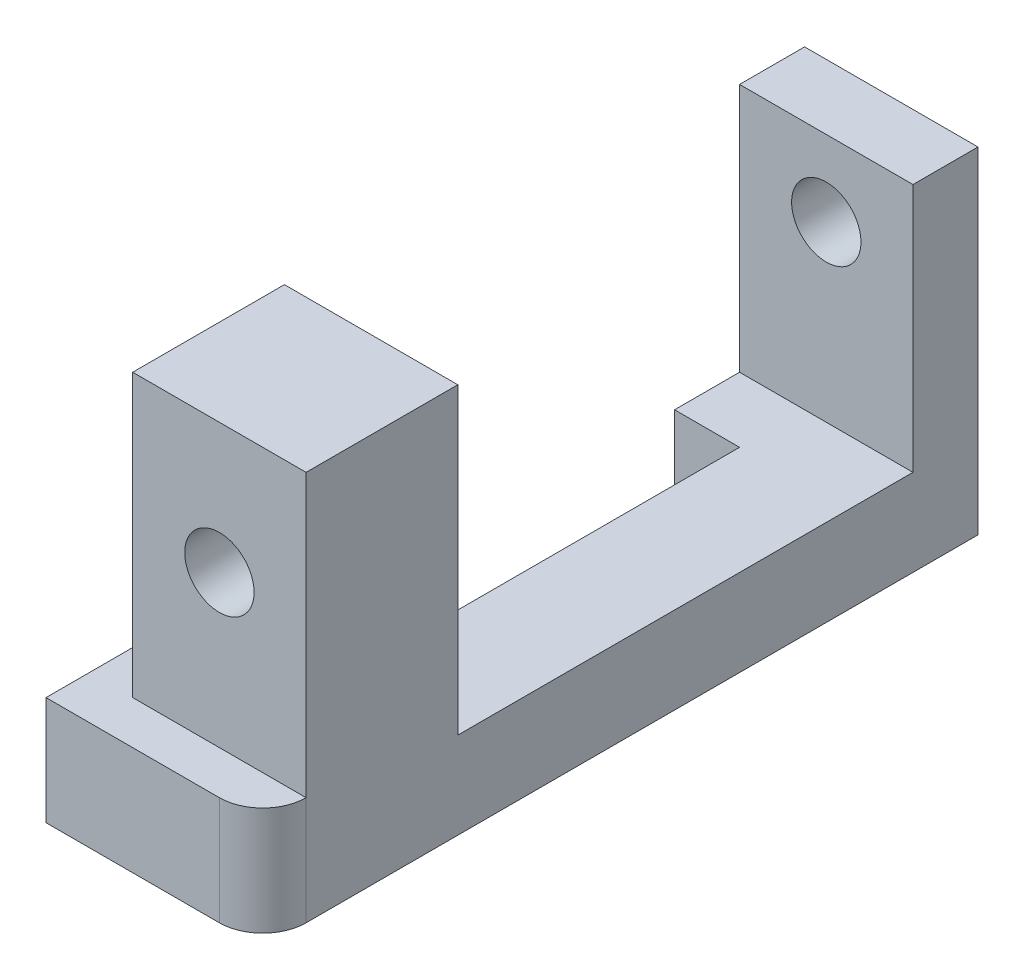
ISO-10303-21;
HEADER;
FILE_DESCRIPTION(('STEP AP214'),'2;1');
FILE_NAME('part.step','',(''),(''),'','','');
FILE_SCHEMA(('AUTOMOTIVE_DESIGN { 1 0 10303 214 1 1 1 1 }'));
ENDSEC;
DATA;
#1=APPLICATION_CONTEXT('core data for automotive mechanical design processes');
#2=APPLICATION_PROTOCOL_DEFINITION('international standard','automotive_design',2000,#1);
#3=PRODUCT_CONTEXT('',#1,'mechanical');
#4=PRODUCT('Part','Part','',(#3));
#5=PRODUCT_RELATED_PRODUCT_CATEGORY('part','',(#4));
#6=PRODUCT_DEFINITION_FORMATION('','',#4);
#7=PRODUCT_DEFINITION_CONTEXT('part definition',#1,'design');
#8=PRODUCT_DEFINITION('design','',#6,#7);
#9=PRODUCT_DEFINITION_SHAPE('','',#8);
#10=(LENGTH_UNIT() NAMED_UNIT(*) SI_UNIT(.MILLI.,.METRE.));
#11=(NAMED_UNIT(*) PLANE_ANGLE_UNIT() SI_UNIT($,.RADIAN.));
#12=(NAMED_UNIT(*) SI_UNIT($,.STERADIAN.) SOLID_ANGLE_UNIT());
#13=UNCERTAINTY_MEASURE_WITH_UNIT(LENGTH_MEASURE(1.E-05),#10,'distance_accuracy_value','');
#14=(GEOMETRIC_REPRESENTATION_CONTEXT(3) GLOBAL_UNCERTAINTY_ASSIGNED_CONTEXT((#13)) GLOBAL_UNIT_ASSIGNED_CONTEXT((#10,
#11,#12)) REPRESENTATION_CONTEXT('',''));
#15=CARTESIAN_POINT('',(0.,0.,0.));
#16=DIRECTION('',(0.,0.,1.));
#17=DIRECTION('',(1.,0.,0.));
#18=AXIS2_PLACEMENT_3D('',#15,#16,#17);
#19=CARTESIAN_POINT('',(-8.,16.,3.));
#20=DIRECTION('',(0.,0.,1.));
#21=DIRECTION('',(0.,-1.,0.));
#22=AXIS2_PLACEMENT_3D('',#19,#20,#21);
#23=PLANE('',#22);
#24=CARTESIAN_POINT('',(-4.,12.,3.));
#25=DIRECTION('',(0.,0.,1.));
#26=DIRECTION('',(0.,-1.,0.));
#27=AXIS2_PLACEMENT_3D('',#24,#25,#26);
#28=CIRCLE('',#27,1.6);
#29=CARTESIAN_POINT('',(-4.,10.4,3.));
#30=VERTEX_POINT('',#29);
#31=EDGE_CURVE('E251',#30,#30,#28,.T.);
#32=ORIENTED_EDGE('',*,*,#31,.F.);
#33=EDGE_LOOP('',(#32));
#34=FACE_BOUND('',#33,.T.);
#35=DIRECTION('',(0.,-1.,0.));
#36=VECTOR('',#35,1.);
#37=CARTESIAN_POINT('',(0.,16.,3.));
#38=LINE('',#37,#36);
#39=CARTESIAN_POINT('',(0.,15.5,3.));
#40=VERTEX_POINT('',#39);
#41=CARTESIAN_POINT('',(0.,4.,3.));
#42=VERTEX_POINT('',#41);
#43=EDGE_CURVE('E163',#40,#42,#38,.T.);
#44=ORIENTED_EDGE('',*,*,#43,.F.);
#45=DIRECTION('',(1.,0.,0.));
#46=VECTOR('',#45,1.);
#47=CARTESIAN_POINT('',(0.,15.5,3.));
#48=LINE('',#47,#46);
#49=CARTESIAN_POINT('',(-8.,15.5,3.));
#50=VERTEX_POINT('',#49);
#51=EDGE_CURVE('E50',#50,#40,#48,.T.);
#52=ORIENTED_EDGE('',*,*,#51,.F.);
#53=DIRECTION('',(0.,-1.,0.));
#54=VECTOR('',#53,1.);
#55=CARTESIAN_POINT('',(-8.,16.,3.));
#56=LINE('',#55,#54);
#57=CARTESIAN_POINT('',(-8.,4.,3.));
#58=VERTEX_POINT('',#57);
#59=EDGE_CURVE('E204',#50,#58,#56,.T.);
#60=ORIENTED_EDGE('',*,*,#59,.T.);
#61=DIRECTION('',(1.,0.,0.));
#62=VECTOR('',#61,1.);
#63=CARTESIAN_POINT('',(-8.,4.,3.));
#64=LINE('',#63,#62);
#65=EDGE_CURVE('E185',#58,#42,#64,.T.);
#66=ORIENTED_EDGE('',*,*,#65,.T.);
#67=EDGE_LOOP('',(#44,#52,#60,#66));
#68=FACE_BOUND('',#67,.T.);
#69=ADVANCED_FACE('F33',(#34,#68),#23,.T.);
#70=CARTESIAN_POINT('',(-8.,0.,0.));
#71=DIRECTION('',(1.,0.,0.));
#72=DIRECTION('',(0.,0.,-1.));
#73=AXIS2_PLACEMENT_3D('',#70,#71,#72);
#74=PLANE('',#73);
#75=DIRECTION('',(0.,0.,1.));
#76=VECTOR('',#75,1.);
#77=CARTESIAN_POINT('',(-8.,15.5,3.));
#78=LINE('',#77,#76);
#79=CARTESIAN_POINT('',(-8.,15.5,0.));
#80=VERTEX_POINT('',#79);
#81=EDGE_CURVE('E157',#80,#50,#78,.T.);
#82=ORIENTED_EDGE('',*,*,#81,.F.);
#83=DIRECTION('',(0.,1.,0.));
#84=VECTOR('',#83,1.);
#85=CARTESIAN_POINT('',(-8.,0.,0.));
#86=LINE('',#85,#84);
#87=CARTESIAN_POINT('',(-8.,0.,0.));
#88=VERTEX_POINT('',#87);
#89=EDGE_CURVE('E156',#88,#80,#86,.T.);
#90=ORIENTED_EDGE('',*,*,#89,.F.);
#91=DIRECTION('',(0.,0.,-1.));
#92=VECTOR('',#91,1.);
#93=CARTESIAN_POINT('',(-8.,0.,31.));
#94=LINE('',#93,#92);
#95=CARTESIAN_POINT('',(-8.,0.,6.));
#96=VERTEX_POINT('',#95);
#97=EDGE_CURVE('E181',#96,#88,#94,.T.);
#98=ORIENTED_EDGE('',*,*,#97,.F.);
#99=DIRECTION('',(0.,-1.,0.));
#100=VECTOR('',#99,1.);
#101=CARTESIAN_POINT('',(-8.,0.,6.));
#102=LINE('',#101,#100);
#103=CARTESIAN_POINT('',(-8.,4.,6.));
#104=VERTEX_POINT('',#103);
#105=EDGE_CURVE('E227',#104,#96,#102,.T.);
#106=ORIENTED_EDGE('',*,*,#105,.F.);
#107=DIRECTION('',(0.,0.,-1.));
#108=VECTOR('',#107,1.);
#109=CARTESIAN_POINT('',(-8.,4.,6.));
#110=LINE('',#109,#108);
#111=EDGE_CURVE('E215',#104,#58,#110,.T.);
#112=ORIENTED_EDGE('',*,*,#111,.T.);
#113=ORIENTED_EDGE('',*,*,#59,.F.);
#114=EDGE_LOOP('',(#82,#90,#98,#106,#112,#113));
#115=FACE_BOUND('',#114,.T.);
#116=ADVANCED_FACE('F281',(#115),#74,.F.);
#117=CARTESIAN_POINT('',(-8.,0.,0.));
#118=DIRECTION('',(0.,0.,-1.));
#119=DIRECTION('',(-1.,0.,0.));
#120=AXIS2_PLACEMENT_3D('',#117,#118,#119);
#121=PLANE('',#120);
#122=CARTESIAN_POINT('',(-4.,12.,0.));
#123=DIRECTION('',(0.,0.,1.));
#124=DIRECTION('',(1.,0.,0.));
#125=AXIS2_PLACEMENT_3D('',#122,#123,#124);
#126=CIRCLE('',#125,1.6);
#127=CARTESIAN_POINT('',(-2.4,12.,0.));
#128=VERTEX_POINT('',#127);
#129=EDGE_CURVE('E272',#128,#128,#126,.T.);
#130=ORIENTED_EDGE('',*,*,#129,.T.);
#131=EDGE_LOOP('',(#130));
#132=FACE_BOUND('',#131,.T.);
#133=ORIENTED_EDGE('',*,*,#89,.T.);
#134=DIRECTION('',(-1.,0.,0.));
#135=VECTOR('',#134,1.);
#136=CARTESIAN_POINT('',(0.,15.5,0.));
#137=LINE('',#136,#135);
#138=CARTESIAN_POINT('',(0.,15.5,0.));
#139=VERTEX_POINT('',#138);
#140=EDGE_CURVE('E142',#139,#80,#137,.T.);
#141=ORIENTED_EDGE('',*,*,#140,.F.);
#142=DIRECTION('',(0.,1.,0.));
#143=VECTOR('',#142,1.);
#144=CARTESIAN_POINT('',(0.,0.,0.));
#145=LINE('',#144,#143);
#146=CARTESIAN_POINT('',(0.,0.,0.));
#147=VERTEX_POINT('',#146);
#148=EDGE_CURVE('E153',#147,#139,#145,.T.);
#149=ORIENTED_EDGE('',*,*,#148,.F.);
#150=DIRECTION('',(1.,0.,0.));
#151=VECTOR('',#150,1.);
#152=CARTESIAN_POINT('',(-8.,0.,0.));
#153=LINE('',#152,#151);
#154=EDGE_CURVE('E37',#88,#147,#153,.T.);
#155=ORIENTED_EDGE('',*,*,#154,.F.);
#156=EDGE_LOOP('',(#133,#141,#149,#155));
#157=FACE_BOUND('',#156,.T.);
#158=ADVANCED_FACE('F151',(#132,#157),#121,.T.);
#159=CARTESIAN_POINT('',(0.,0.,0.));
#160=DIRECTION('',(1.,0.,0.));
#161=DIRECTION('',(0.,0.,-1.));
#162=AXIS2_PLACEMENT_3D('',#159,#160,#161);
#163=PLANE('',#162);
#164=ORIENTED_EDGE('',*,*,#148,.T.);
#165=DIRECTION('',(0.,0.,-1.));
#166=VECTOR('',#165,1.);
#167=CARTESIAN_POINT('',(0.,15.5,3.));
#168=LINE('',#167,#166);
#169=EDGE_CURVE('E139',#40,#139,#168,.T.);
#170=ORIENTED_EDGE('',*,*,#169,.F.);
#171=ORIENTED_EDGE('',*,*,#43,.T.);
#172=DIRECTION('',(0.,0.,1.));
#173=VECTOR('',#172,1.);
#174=CARTESIAN_POINT('',(0.,4.,3.));
#175=LINE('',#174,#173);
#176=CARTESIAN_POINT('',(0.,4.,24.));
#177=VERTEX_POINT('',#176);
#178=EDGE_CURVE('E165',#42,#177,#175,.T.);
#179=ORIENTED_EDGE('',*,*,#178,.T.);
#180=DIRECTION('',(0.,1.,0.));
#181=VECTOR('',#180,1.);
#182=CARTESIAN_POINT('',(0.,4.,24.));
#183=LINE('',#182,#181);
#184=CARTESIAN_POINT('',(0.,18.,24.));
#185=VERTEX_POINT('',#184);
#186=EDGE_CURVE('E173',#177,#185,#183,.T.);
#187=ORIENTED_EDGE('',*,*,#186,.T.);
#188=DIRECTION('',(0.,0.,1.));
#189=VECTOR('',#188,1.);
#190=CARTESIAN_POINT('',(0.,18.,24.));
#191=LINE('',#190,#189);
#192=CARTESIAN_POINT('',(0.,18.,31.));
#193=VERTEX_POINT('',#192);
#194=EDGE_CURVE('E176',#185,#193,#191,.T.);
#195=ORIENTED_EDGE('',*,*,#194,.T.);
#196=DIRECTION('',(0.,-1.,0.));
#197=VECTOR('',#196,1.);
#198=CARTESIAN_POINT('',(0.,18.,31.));
#199=LINE('',#198,#197);
#200=CARTESIAN_POINT('',(0.,5.,31.));
#201=VERTEX_POINT('',#200);
#202=EDGE_CURVE('E179',#193,#201,#199,.T.);
#203=ORIENTED_EDGE('',*,*,#202,.T.);
#204=DIRECTION('',(0.,-1.,0.));
#205=VECTOR('',#204,1.);
#206=CARTESIAN_POINT('',(0.,5.,31.));
#207=LINE('',#206,#205);
#208=CARTESIAN_POINT('',(0.,0.,31.));
#209=VERTEX_POINT('',#208);
#210=EDGE_CURVE('E230',#201,#209,#207,.T.);
#211=ORIENTED_EDGE('',*,*,#210,.T.);
#212=DIRECTION('',(0.,0.,-1.));
#213=VECTOR('',#212,1.);
#214=CARTESIAN_POINT('',(0.,0.,31.));
#215=LINE('',#214,#213);
#216=EDGE_CURVE('E162',#209,#147,#215,.T.);
#217=ORIENTED_EDGE('',*,*,#216,.T.);
#218=EDGE_LOOP('',(#164,#170,#171,#179,#187,#195,#203,#211,#217));
#219=FACE_BOUND('',#218,.T.);
#220=ADVANCED_FACE('F159',(#219),#163,.T.);
#221=DIRECTION('',(0.,0.,1.));
#222=VECTOR('',#221,1.);
#223=CARTESIAN_POINT('',(-8.,5.,31.));
#224=LINE('',#223,#222);
#225=CARTESIAN_POINT('',(-8.,5.,24.));
#226=VERTEX_POINT('',#225);
#227=CARTESIAN_POINT('',(-8.,5.,31.));
#228=VERTEX_POINT('',#227);
#229=EDGE_CURVE('E262',#226,#228,#224,.T.);
#230=ORIENTED_EDGE('',*,*,#229,.T.);
#231=DIRECTION('',(0.,-1.,0.));
#232=VECTOR('',#231,1.);
#233=CARTESIAN_POINT('',(-8.,18.,31.));
#234=LINE('',#233,#232);
#235=CARTESIAN_POINT('',(-8.,18.,31.));
#236=VERTEX_POINT('',#235);
#237=EDGE_CURVE('E190',#236,#228,#234,.T.);
#238=ORIENTED_EDGE('',*,*,#237,.F.);
#239=DIRECTION('',(0.,0.,1.));
#240=VECTOR('',#239,1.);
#241=CARTESIAN_POINT('',(-8.,18.,24.));
#242=LINE('',#241,#240);
#243=CARTESIAN_POINT('',(-8.,18.,24.));
#244=VERTEX_POINT('',#243);
#245=EDGE_CURVE('E193',#244,#236,#242,.T.);
#246=ORIENTED_EDGE('',*,*,#245,.F.);
#247=DIRECTION('',(0.,1.,0.));
#248=VECTOR('',#247,1.);
#249=CARTESIAN_POINT('',(-8.,4.,24.));
#250=LINE('',#249,#248);
#251=EDGE_CURVE('E203',#226,#244,#250,.T.);
#252=ORIENTED_EDGE('',*,*,#251,.F.);
#253=EDGE_LOOP('',(#230,#238,#246,#252));
#254=FACE_BOUND('',#253,.T.);
#255=ADVANCED_FACE('F336',(#254),#74,.F.);
#256=CARTESIAN_POINT('',(-8.,18.,31.));
#257=DIRECTION('',(0.,0.,1.));
#258=DIRECTION('',(0.,-1.,0.));
#259=AXIS2_PLACEMENT_3D('',#256,#257,#258);
#260=PLANE('',#259);
#261=CARTESIAN_POINT('',(-4.,12.,31.));
#262=DIRECTION('',(0.,0.,1.));
#263=DIRECTION('',(1.,0.,0.));
#264=AXIS2_PLACEMENT_3D('',#261,#262,#263);
#265=CIRCLE('',#264,1.6);
#266=CARTESIAN_POINT('',(-2.4,12.,31.));
#267=VERTEX_POINT('',#266);
#268=EDGE_CURVE('E273',#267,#267,#265,.T.);
#269=ORIENTED_EDGE('',*,*,#268,.F.);
#270=EDGE_LOOP('',(#269));
#271=FACE_BOUND('',#270,.T.);
#272=ORIENTED_EDGE('',*,*,#237,.T.);
#273=DIRECTION('',(1.,0.,0.));
#274=VECTOR('',#273,1.);
#275=CARTESIAN_POINT('',(0.,5.,31.));
#276=LINE('',#275,#274);
#277=EDGE_CURVE('E260',#228,#201,#276,.T.);
#278=ORIENTED_EDGE('',*,*,#277,.T.);
#279=ORIENTED_EDGE('',*,*,#202,.F.);
#280=DIRECTION('',(1.,0.,0.));
#281=VECTOR('',#280,1.);
#282=CARTESIAN_POINT('',(-8.,18.,31.));
#283=LINE('',#282,#281);
#284=EDGE_CURVE('E11',#236,#193,#283,.T.);
#285=ORIENTED_EDGE('',*,*,#284,.F.);
#286=EDGE_LOOP('',(#272,#278,#279,#285));
#287=FACE_BOUND('',#286,.T.);
#288=ADVANCED_FACE('F299',(#271,#287),#260,.T.);
#289=CARTESIAN_POINT('',(-3.,0.,30.4031242374328));
#290=DIRECTION('',(-0.894427190999916,-0.447213595499958,0.));
#291=DIRECTION('',(0.447213595499958,-0.894427190999916,0.));
#292=AXIS2_PLACEMENT_3D('',#289,#290,#291);
#293=PLANE('',#292);
#294=DIRECTION('',(0.,0.,-1.));
#295=VECTOR('',#294,1.);
#296=CARTESIAN_POINT('',(-5.,4.,30.4031242374328));
#297=LINE('',#296,#295);
#298=CARTESIAN_POINT('',(-5.,4.,24.));
#299=VERTEX_POINT('',#298);
#300=CARTESIAN_POINT('',(-5.,4.,6.));
#301=VERTEX_POINT('',#300);
#302=EDGE_CURVE('E212',#299,#301,#297,.T.);
#303=ORIENTED_EDGE('',*,*,#302,.T.);
#304=DIRECTION('',(-0.447213595499958,0.894427190999916,0.));
#305=VECTOR('',#304,1.);
#306=CARTESIAN_POINT('',(-5.,4.,6.));
#307=LINE('',#306,#305);
#308=CARTESIAN_POINT('',(-3.,0.,6.));
#309=VERTEX_POINT('',#308);
#310=EDGE_CURVE('E224',#309,#301,#307,.T.);
#311=ORIENTED_EDGE('',*,*,#310,.F.);
#312=DIRECTION('',(0.,0.,-1.));
#313=VECTOR('',#312,1.);
#314=CARTESIAN_POINT('',(-3.,0.,30.4031242374328));
#315=LINE('',#314,#313);
#316=CARTESIAN_POINT('',(-3.,0.,24.));
#317=VERTEX_POINT('',#316);
#318=EDGE_CURVE('E208',#317,#309,#315,.T.);
#319=ORIENTED_EDGE('',*,*,#318,.F.);
#320=DIRECTION('',(0.447213595499958,-0.894427190999916,0.));
#321=VECTOR('',#320,1.);
#322=CARTESIAN_POINT('',(-3.,0.,24.));
#323=LINE('',#322,#321);
#324=EDGE_CURVE('E211',#299,#317,#323,.T.);
#325=ORIENTED_EDGE('',*,*,#324,.F.);
#326=EDGE_LOOP('',(#303,#311,#319,#325));
#327=FACE_BOUND('',#326,.T.);
#328=ADVANCED_FACE('F315',(#327),#293,.T.);
#329=CARTESIAN_POINT('',(-8.,0.,31.));
#330=DIRECTION('',(0.,-1.,0.));
#331=DIRECTION('',(0.,0.,-1.));
#332=AXIS2_PLACEMENT_3D('',#329,#330,#331);
#333=PLANE('',#332);
#334=CARTESIAN_POINT('',(-8.,0.,26.));
#335=DIRECTION('',(0.,-1.,0.));
#336=DIRECTION('',(0.,0.,-1.));
#337=AXIS2_PLACEMENT_3D('',#334,#335,#336);
#338=CIRCLE('',#337,2.);
#339=CARTESIAN_POINT('',(-10.,0.,26.));
#340=VERTEX_POINT('',#339);
#341=CARTESIAN_POINT('',(-8.,0.,24.));
#342=VERTEX_POINT('',#341);
#343=EDGE_CURVE('E248',#340,#342,#338,.T.);
#344=ORIENTED_EDGE('',*,*,#343,.T.);
#345=DIRECTION('',(-1.,0.,0.));
#346=VECTOR('',#345,1.);
#347=CARTESIAN_POINT('',(-8.,0.,24.));
#348=LINE('',#347,#346);
#349=EDGE_CURVE('E167',#317,#342,#348,.T.);
#350=ORIENTED_EDGE('',*,*,#349,.F.);
#351=ORIENTED_EDGE('',*,*,#318,.T.);
#352=DIRECTION('',(1.,0.,0.));
#353=VECTOR('',#352,1.);
#354=CARTESIAN_POINT('',(-3.,0.,6.));
#355=LINE('',#354,#353);
#356=EDGE_CURVE('E58',#96,#309,#355,.T.);
#357=ORIENTED_EDGE('',*,*,#356,.F.);
#358=ORIENTED_EDGE('',*,*,#97,.T.);
#359=ORIENTED_EDGE('',*,*,#154,.T.);
#360=ORIENTED_EDGE('',*,*,#216,.F.);
#361=CARTESIAN_POINT('',(-2.,0.,31.));
#362=DIRECTION('',(0.,-1.,0.));
#363=DIRECTION('',(0.,0.,1.));
#364=AXIS2_PLACEMENT_3D('',#361,#362,#363);
#365=CIRCLE('',#364,2.);
#366=CARTESIAN_POINT('',(-2.,0.,33.));
#367=VERTEX_POINT('',#366);
#368=EDGE_CURVE('E245',#209,#367,#365,.T.);
#369=ORIENTED_EDGE('',*,*,#368,.T.);
#370=DIRECTION('',(-1.,0.,0.));
#371=VECTOR('',#370,1.);
#372=CARTESIAN_POINT('',(-10.,0.,33.));
#373=LINE('',#372,#371);
#374=CARTESIAN_POINT('',(-10.,0.,33.));
#375=VERTEX_POINT('',#374);
#376=EDGE_CURVE('E242',#367,#375,#373,.T.);
#377=ORIENTED_EDGE('',*,*,#376,.T.);
#378=DIRECTION('',(0.,0.,-1.));
#379=VECTOR('',#378,1.);
#380=CARTESIAN_POINT('',(-10.,0.,26.));
#381=LINE('',#380,#379);
#382=EDGE_CURVE('E238',#375,#340,#381,.T.);
#383=ORIENTED_EDGE('',*,*,#382,.T.);
#384=EDGE_LOOP('',(#344,#350,#351,#357,#358,#359,#360,#369,#377,#383));
#385=FACE_BOUND('',#384,.T.);
#386=ADVANCED_FACE('F35',(#385),#333,.T.);
#387=CARTESIAN_POINT('',(-8.,4.,3.));
#388=DIRECTION('',(0.,1.,0.));
#389=DIRECTION('',(0.,0.,1.));
#390=AXIS2_PLACEMENT_3D('',#387,#388,#389);
#391=PLANE('',#390);
#392=ORIENTED_EDGE('',*,*,#65,.F.);
#393=ORIENTED_EDGE('',*,*,#111,.F.);
#394=DIRECTION('',(-1.,0.,0.));
#395=VECTOR('',#394,1.);
#396=CARTESIAN_POINT('',(-8.,4.,6.));
#397=LINE('',#396,#395);
#398=EDGE_CURVE('E222',#301,#104,#397,.T.);
#399=ORIENTED_EDGE('',*,*,#398,.F.);
#400=ORIENTED_EDGE('',*,*,#302,.F.);
#401=DIRECTION('',(1.,0.,0.));
#402=VECTOR('',#401,1.);
#403=CARTESIAN_POINT('',(-8.,4.,24.));
#404=LINE('',#403,#402);
#405=EDGE_CURVE('E184',#299,#177,#404,.T.);
#406=ORIENTED_EDGE('',*,*,#405,.T.);
#407=ORIENTED_EDGE('',*,*,#178,.F.);
#408=EDGE_LOOP('',(#392,#393,#399,#400,#406,#407));
#409=FACE_BOUND('',#408,.T.);
#410=ADVANCED_FACE('F286',(#409),#391,.T.);
#411=CARTESIAN_POINT('',(-8.,18.,24.));
#412=DIRECTION('',(0.,1.,0.));
#413=DIRECTION('',(0.,0.,1.));
#414=AXIS2_PLACEMENT_3D('',#411,#412,#413);
#415=PLANE('',#414);
#416=ORIENTED_EDGE('',*,*,#194,.F.);
#417=DIRECTION('',(1.,0.,0.));
#418=VECTOR('',#417,1.);
#419=CARTESIAN_POINT('',(-8.,18.,24.));
#420=LINE('',#419,#418);
#421=EDGE_CURVE('E42',#244,#185,#420,.T.);
#422=ORIENTED_EDGE('',*,*,#421,.F.);
#423=ORIENTED_EDGE('',*,*,#245,.T.);
#424=ORIENTED_EDGE('',*,*,#284,.T.);
#425=EDGE_LOOP('',(#416,#422,#423,#424));
#426=FACE_BOUND('',#425,.T.);
#427=ADVANCED_FACE('F298',(#426),#415,.T.);
#428=CARTESIAN_POINT('',(-8.,4.,24.));
#429=DIRECTION('',(0.,0.,-1.));
#430=DIRECTION('',(-1.,0.,0.));
#431=AXIS2_PLACEMENT_3D('',#428,#429,#430);
#432=PLANE('',#431);
#433=CARTESIAN_POINT('',(-4.,12.,24.));
#434=DIRECTION('',(0.,0.,-1.));
#435=DIRECTION('',(-1.,0.,0.));
#436=AXIS2_PLACEMENT_3D('',#433,#434,#435);
#437=CIRCLE('',#436,1.6);
#438=CARTESIAN_POINT('',(-5.6,12.,24.));
#439=VERTEX_POINT('',#438);
#440=EDGE_CURVE('E269',#439,#439,#437,.T.);
#441=ORIENTED_EDGE('',*,*,#440,.F.);
#442=EDGE_LOOP('',(#441));
#443=FACE_BOUND('',#442,.T.);
#444=ORIENTED_EDGE('',*,*,#186,.F.);
#445=ORIENTED_EDGE('',*,*,#405,.F.);
#446=ORIENTED_EDGE('',*,*,#324,.T.);
#447=ORIENTED_EDGE('',*,*,#349,.T.);
#448=EDGE_CURVE('E198',#342,#226,#250,.T.);
#449=ORIENTED_EDGE('',*,*,#448,.T.);
#450=ORIENTED_EDGE('',*,*,#251,.T.);
#451=ORIENTED_EDGE('',*,*,#421,.T.);
#452=EDGE_LOOP('',(#444,#445,#446,#447,#449,#450,#451));
#453=FACE_BOUND('',#452,.T.);
#454=ADVANCED_FACE('F293',(#443,#453),#432,.T.);
#455=CARTESIAN_POINT('',(0.,0.,6.));
#456=DIRECTION('',(0.,0.,-1.));
#457=DIRECTION('',(-1.,0.,0.));
#458=AXIS2_PLACEMENT_3D('',#455,#456,#457);
#459=PLANE('',#458);
#460=ORIENTED_EDGE('',*,*,#105,.T.);
#461=ORIENTED_EDGE('',*,*,#356,.T.);
#462=ORIENTED_EDGE('',*,*,#310,.T.);
#463=ORIENTED_EDGE('',*,*,#398,.T.);
#464=EDGE_LOOP('',(#460,#461,#462,#463));
#465=FACE_BOUND('',#464,.T.);
#466=ADVANCED_FACE('F316',(#465),#459,.F.);
#467=CARTESIAN_POINT('',(-8.,5.,26.));
#468=DIRECTION('',(0.,-1.,0.));
#469=DIRECTION('',(0.,0.,-1.));
#470=AXIS2_PLACEMENT_3D('',#467,#468,#469);
#471=CYLINDRICAL_SURFACE('',#470,2.);
#472=ORIENTED_EDGE('',*,*,#343,.F.);
#473=DIRECTION('',(0.,-1.,0.));
#474=VECTOR('',#473,1.);
#475=CARTESIAN_POINT('',(-10.,5.,26.));
#476=LINE('',#475,#474);
#477=CARTESIAN_POINT('',(-10.,5.,26.));
#478=VERTEX_POINT('',#477);
#479=EDGE_CURVE('E229',#478,#340,#476,.T.);
#480=ORIENTED_EDGE('',*,*,#479,.F.);
#481=CARTESIAN_POINT('',(-8.,5.,26.));
#482=DIRECTION('',(0.,-1.,0.));
#483=DIRECTION('',(0.,0.,-1.));
#484=AXIS2_PLACEMENT_3D('',#481,#482,#483);
#485=CIRCLE('',#484,2.);
#486=EDGE_CURVE('E241',#478,#226,#485,.T.);
#487=ORIENTED_EDGE('',*,*,#486,.T.);
#488=ORIENTED_EDGE('',*,*,#448,.F.);
#489=EDGE_LOOP('',(#472,#480,#487,#488));
#490=FACE_BOUND('',#489,.T.);
#491=ADVANCED_FACE('F318',(#490),#471,.T.);
#492=CARTESIAN_POINT('',(-10.,5.,26.));
#493=DIRECTION('',(-1.,0.,0.));
#494=DIRECTION('',(0.,0.,1.));
#495=AXIS2_PLACEMENT_3D('',#492,#493,#494);
#496=PLANE('',#495);
#497=ORIENTED_EDGE('',*,*,#382,.F.);
#498=DIRECTION('',(0.,-1.,0.));
#499=VECTOR('',#498,1.);
#500=CARTESIAN_POINT('',(-10.,5.,33.));
#501=LINE('',#500,#499);
#502=CARTESIAN_POINT('',(-10.,5.,33.));
#503=VERTEX_POINT('',#502);
#504=EDGE_CURVE('E235',#503,#375,#501,.T.);
#505=ORIENTED_EDGE('',*,*,#504,.F.);
#506=DIRECTION('',(0.,0.,-1.));
#507=VECTOR('',#506,1.);
#508=CARTESIAN_POINT('',(-10.,5.,26.));
#509=LINE('',#508,#507);
#510=EDGE_CURVE('E233',#503,#478,#509,.T.);
#511=ORIENTED_EDGE('',*,*,#510,.T.);
#512=ORIENTED_EDGE('',*,*,#479,.T.);
#513=EDGE_LOOP('',(#497,#505,#511,#512));
#514=FACE_BOUND('',#513,.T.);
#515=ADVANCED_FACE('F310',(#514),#496,.T.);
#516=CARTESIAN_POINT('',(-10.,5.,33.));
#517=DIRECTION('',(0.,0.,1.));
#518=DIRECTION('',(1.,0.,0.));
#519=AXIS2_PLACEMENT_3D('',#516,#517,#518);
#520=PLANE('',#519);
#521=ORIENTED_EDGE('',*,*,#376,.F.);
#522=DIRECTION('',(0.,-1.,0.));
#523=VECTOR('',#522,1.);
#524=CARTESIAN_POINT('',(-2.,5.,33.));
#525=LINE('',#524,#523);
#526=CARTESIAN_POINT('',(-2.,5.,33.));
#527=VERTEX_POINT('',#526);
#528=EDGE_CURVE('E232',#527,#367,#525,.T.);
#529=ORIENTED_EDGE('',*,*,#528,.F.);
#530=DIRECTION('',(-1.,0.,0.));
#531=VECTOR('',#530,1.);
#532=CARTESIAN_POINT('',(-10.,5.,33.));
#533=LINE('',#532,#531);
#534=EDGE_CURVE('E254',#527,#503,#533,.T.);
#535=ORIENTED_EDGE('',*,*,#534,.T.);
#536=ORIENTED_EDGE('',*,*,#504,.T.);
#537=EDGE_LOOP('',(#521,#529,#535,#536));
#538=FACE_BOUND('',#537,.T.);
#539=ADVANCED_FACE('F307',(#538),#520,.T.);
#540=CARTESIAN_POINT('',(-2.,5.,31.));
#541=DIRECTION('',(0.,-1.,0.));
#542=DIRECTION('',(0.,0.,-1.));
#543=AXIS2_PLACEMENT_3D('',#540,#541,#542);
#544=CYLINDRICAL_SURFACE('',#543,2.);
#545=ORIENTED_EDGE('',*,*,#368,.F.);
#546=ORIENTED_EDGE('',*,*,#210,.F.);
#547=CARTESIAN_POINT('',(-2.,5.,31.));
#548=DIRECTION('',(0.,-1.,0.));
#549=DIRECTION('',(0.,0.,1.));
#550=AXIS2_PLACEMENT_3D('',#547,#548,#549);
#551=CIRCLE('',#550,2.);
#552=EDGE_CURVE('E257',#201,#527,#551,.T.);
#553=ORIENTED_EDGE('',*,*,#552,.T.);
#554=ORIENTED_EDGE('',*,*,#528,.T.);
#555=EDGE_LOOP('',(#545,#546,#553,#554));
#556=FACE_BOUND('',#555,.T.);
#557=ADVANCED_FACE('F304',(#556),#544,.T.);
#558=CARTESIAN_POINT('',(-8.,5.,26.));
#559=DIRECTION('',(0.,-1.,0.));
#560=DIRECTION('',(0.,0.,-1.));
#561=AXIS2_PLACEMENT_3D('',#558,#559,#560);
#562=PLANE('',#561);
#563=ORIENTED_EDGE('',*,*,#486,.F.);
#564=ORIENTED_EDGE('',*,*,#510,.F.);
#565=ORIENTED_EDGE('',*,*,#534,.F.);
#566=ORIENTED_EDGE('',*,*,#552,.F.);
#567=ORIENTED_EDGE('',*,*,#277,.F.);
#568=ORIENTED_EDGE('',*,*,#229,.F.);
#569=EDGE_LOOP('',(#563,#564,#565,#566,#567,#568));
#570=FACE_BOUND('',#569,.T.);
#571=ADVANCED_FACE('F350',(#570),#562,.F.);
#572=CARTESIAN_POINT('',(-4.,12.,0.));
#573=DIRECTION('',(0.,0.,1.));
#574=DIRECTION('',(1.,0.,0.));
#575=AXIS2_PLACEMENT_3D('',#572,#573,#574);
#576=CYLINDRICAL_SURFACE('',#575,1.6);
#577=ORIENTED_EDGE('',*,*,#31,.T.);
#578=EDGE_LOOP('',(#577));
#579=FACE_BOUND('',#578,.T.);
#580=ORIENTED_EDGE('',*,*,#129,.F.);
#581=EDGE_LOOP('',(#580));
#582=FACE_BOUND('',#581,.T.);
#583=ADVANCED_FACE('F347',(#579,#582),#576,.F.);
#584=ORIENTED_EDGE('',*,*,#440,.T.);
#585=EDGE_LOOP('',(#584));
#586=FACE_BOUND('',#585,.T.);
#587=ORIENTED_EDGE('',*,*,#268,.T.);
#588=EDGE_LOOP('',(#587));
#589=FACE_BOUND('',#588,.T.);
#590=ADVANCED_FACE('F349',(#586,#589),#576,.F.);
#591=CARTESIAN_POINT('',(0.,15.5,0.));
#592=DIRECTION('',(0.,1.,0.));
#593=DIRECTION('',(0.,0.,1.));
#594=AXIS2_PLACEMENT_3D('',#591,#592,#593);
#595=PLANE('',#594);
#596=ORIENTED_EDGE('',*,*,#169,.T.);
#597=ORIENTED_EDGE('',*,*,#140,.T.);
#598=ORIENTED_EDGE('',*,*,#81,.T.);
#599=ORIENTED_EDGE('',*,*,#51,.T.);
#600=EDGE_LOOP('',(#596,#597,#598,#599));
#601=FACE_BOUND('',#600,.T.);
#602=ADVANCED_FACE('F141',(#601),#595,.T.);
#603=CLOSED_SHELL('',(#69,#116,#158,#220,#255,#288,#328,#386,#410,#427,#454,#466,#491,#515,#539,
#557,#571,#583,#590,#602));
#604=MANIFOLD_SOLID_BREP('B2',#603);
#605=ADVANCED_BREP_SHAPE_REPRESENTATION('',(#18,#604),#14);
#606=SHAPE_DEFINITION_REPRESENTATION(#9,#605);
ENDSEC;
END-ISO-10303-21;
